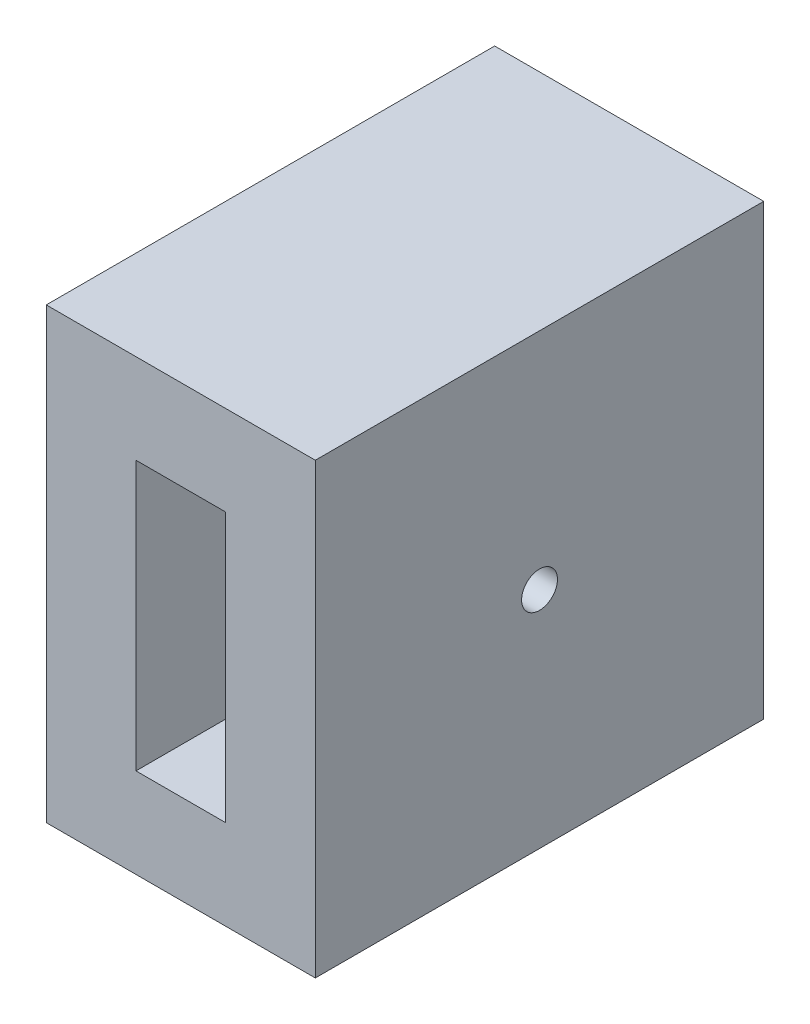
ISO-10303-21;
HEADER;
FILE_DESCRIPTION(('STEP AP214'),'2;1');
FILE_NAME('part.step','',(''),(''),'','','');
FILE_SCHEMA(('AUTOMOTIVE_DESIGN { 1 0 10303 214 1 1 1 1 }'));
ENDSEC;
DATA;
#1=APPLICATION_CONTEXT('core data for automotive mechanical design processes');
#2=APPLICATION_PROTOCOL_DEFINITION('international standard','automotive_design',2000,#1);
#3=PRODUCT_CONTEXT('',#1,'mechanical');
#4=PRODUCT('Part','Part','',(#3));
#5=PRODUCT_RELATED_PRODUCT_CATEGORY('part','',(#4));
#6=PRODUCT_DEFINITION_FORMATION('','',#4);
#7=PRODUCT_DEFINITION_CONTEXT('part definition',#1,'design');
#8=PRODUCT_DEFINITION('design','',#6,#7);
#9=PRODUCT_DEFINITION_SHAPE('','',#8);
#10=(LENGTH_UNIT() NAMED_UNIT(*) SI_UNIT(.MILLI.,.METRE.));
#11=(NAMED_UNIT(*) PLANE_ANGLE_UNIT() SI_UNIT($,.RADIAN.));
#12=(NAMED_UNIT(*) SI_UNIT($,.STERADIAN.) SOLID_ANGLE_UNIT());
#13=UNCERTAINTY_MEASURE_WITH_UNIT(LENGTH_MEASURE(1.E-05),#10,'distance_accuracy_value','');
#14=(GEOMETRIC_REPRESENTATION_CONTEXT(3) GLOBAL_UNCERTAINTY_ASSIGNED_CONTEXT((#13)) GLOBAL_UNIT_ASSIGNED_CONTEXT((#10,
#11,#12)) REPRESENTATION_CONTEXT('',''));
#15=CARTESIAN_POINT('',(0.,0.,0.));
#16=DIRECTION('',(0.,0.,1.));
#17=DIRECTION('',(1.,0.,0.));
#18=AXIS2_PLACEMENT_3D('',#15,#16,#17);
#19=CARTESIAN_POINT('',(0.,0.,50.));
#20=DIRECTION('',(0.,0.,1.));
#21=DIRECTION('',(1.,0.,0.));
#22=AXIS2_PLACEMENT_3D('',#19,#20,#21);
#23=PLANE('',#22);
#24=DIRECTION('',(0.,-1.,0.));
#25=VECTOR('',#24,1.);
#26=CARTESIAN_POINT('',(-15.,25.,50.));
#27=LINE('',#26,#25);
#28=CARTESIAN_POINT('',(-15.,25.,50.));
#29=VERTEX_POINT('',#28);
#30=CARTESIAN_POINT('',(-15.,-25.,50.));
#31=VERTEX_POINT('',#30);
#32=EDGE_CURVE('E137',#29,#31,#27,.T.);
#33=ORIENTED_EDGE('',*,*,#32,.T.);
#34=DIRECTION('',(1.,0.,0.));
#35=VECTOR('',#34,1.);
#36=CARTESIAN_POINT('',(-15.,-25.,50.));
#37=LINE('',#36,#35);
#38=CARTESIAN_POINT('',(15.,-25.,50.));
#39=VERTEX_POINT('',#38);
#40=EDGE_CURVE('E140',#31,#39,#37,.T.);
#41=ORIENTED_EDGE('',*,*,#40,.T.);
#42=DIRECTION('',(0.,1.,0.));
#43=VECTOR('',#42,1.);
#44=CARTESIAN_POINT('',(15.,25.,50.));
#45=LINE('',#44,#43);
#46=CARTESIAN_POINT('',(15.,25.,50.));
#47=VERTEX_POINT('',#46);
#48=EDGE_CURVE('E143',#39,#47,#45,.T.);
#49=ORIENTED_EDGE('',*,*,#48,.T.);
#50=DIRECTION('',(-1.,0.,0.));
#51=VECTOR('',#50,1.);
#52=CARTESIAN_POINT('',(-15.,25.,50.));
#53=LINE('',#52,#51);
#54=EDGE_CURVE('E145',#47,#29,#53,.T.);
#55=ORIENTED_EDGE('',*,*,#54,.T.);
#56=EDGE_LOOP('',(#33,#41,#49,#55));
#57=FACE_BOUND('',#56,.T.);
#58=DIRECTION('',(-1.,0.,0.));
#59=VECTOR('',#58,1.);
#60=CARTESIAN_POINT('',(-5.,15.,50.));
#61=LINE('',#60,#59);
#62=CARTESIAN_POINT('',(5.,15.,50.));
#63=VERTEX_POINT('',#62);
#64=CARTESIAN_POINT('',(-5.,15.,50.));
#65=VERTEX_POINT('',#64);
#66=EDGE_CURVE('E107',#63,#65,#61,.T.);
#67=ORIENTED_EDGE('',*,*,#66,.F.);
#68=DIRECTION('',(0.,1.,0.));
#69=VECTOR('',#68,1.);
#70=CARTESIAN_POINT('',(5.,15.,50.));
#71=LINE('',#70,#69);
#72=CARTESIAN_POINT('',(5.,-15.,50.));
#73=VERTEX_POINT('',#72);
#74=EDGE_CURVE('E99',#73,#63,#71,.T.);
#75=ORIENTED_EDGE('',*,*,#74,.F.);
#76=DIRECTION('',(1.,0.,0.));
#77=VECTOR('',#76,1.);
#78=CARTESIAN_POINT('',(-5.,-15.,50.));
#79=LINE('',#78,#77);
#80=CARTESIAN_POINT('',(-5.,-15.,50.));
#81=VERTEX_POINT('',#80);
#82=EDGE_CURVE('E121',#81,#73,#79,.T.);
#83=ORIENTED_EDGE('',*,*,#82,.F.);
#84=DIRECTION('',(0.,-1.,0.));
#85=VECTOR('',#84,1.);
#86=CARTESIAN_POINT('',(-5.,15.,50.));
#87=LINE('',#86,#85);
#88=EDGE_CURVE('E119',#65,#81,#87,.T.);
#89=ORIENTED_EDGE('',*,*,#88,.F.);
#90=EDGE_LOOP('',(#67,#75,#83,#89));
#91=FACE_BOUND('',#90,.T.);
#92=ADVANCED_FACE('F34',(#57,#91),#23,.T.);
#93=CARTESIAN_POINT('',(0.,0.,0.));
#94=DIRECTION('',(0.,0.,1.));
#95=DIRECTION('',(1.,0.,0.));
#96=AXIS2_PLACEMENT_3D('',#93,#94,#95);
#97=PLANE('',#96);
#98=DIRECTION('',(0.,-1.,0.));
#99=VECTOR('',#98,1.);
#100=CARTESIAN_POINT('',(-15.,25.,0.));
#101=LINE('',#100,#99);
#102=CARTESIAN_POINT('',(-15.,25.,0.));
#103=VERTEX_POINT('',#102);
#104=CARTESIAN_POINT('',(-15.,-25.,0.));
#105=VERTEX_POINT('',#104);
#106=EDGE_CURVE('E115',#103,#105,#101,.T.);
#107=ORIENTED_EDGE('',*,*,#106,.F.);
#108=DIRECTION('',(-1.,0.,0.));
#109=VECTOR('',#108,1.);
#110=CARTESIAN_POINT('',(-15.,25.,0.));
#111=LINE('',#110,#109);
#112=CARTESIAN_POINT('',(15.,25.,0.));
#113=VERTEX_POINT('',#112);
#114=EDGE_CURVE('E141',#113,#103,#111,.T.);
#115=ORIENTED_EDGE('',*,*,#114,.F.);
#116=DIRECTION('',(0.,1.,0.));
#117=VECTOR('',#116,1.);
#118=CARTESIAN_POINT('',(15.,25.,0.));
#119=LINE('',#118,#117);
#120=CARTESIAN_POINT('',(15.,-25.,0.));
#121=VERTEX_POINT('',#120);
#122=EDGE_CURVE('E152',#121,#113,#119,.T.);
#123=ORIENTED_EDGE('',*,*,#122,.F.);
#124=DIRECTION('',(1.,0.,0.));
#125=VECTOR('',#124,1.);
#126=CARTESIAN_POINT('',(-15.,-25.,0.));
#127=LINE('',#126,#125);
#128=EDGE_CURVE('E150',#105,#121,#127,.T.);
#129=ORIENTED_EDGE('',*,*,#128,.F.);
#130=EDGE_LOOP('',(#107,#115,#123,#129));
#131=FACE_BOUND('',#130,.T.);
#132=DIRECTION('',(0.,1.,0.));
#133=VECTOR('',#132,1.);
#134=CARTESIAN_POINT('',(5.,15.,0.));
#135=LINE('',#134,#133);
#136=CARTESIAN_POINT('',(5.,-15.,0.));
#137=VERTEX_POINT('',#136);
#138=CARTESIAN_POINT('',(5.,15.,0.));
#139=VERTEX_POINT('',#138);
#140=EDGE_CURVE('E57',#137,#139,#135,.T.);
#141=ORIENTED_EDGE('',*,*,#140,.T.);
#142=DIRECTION('',(-1.,0.,0.));
#143=VECTOR('',#142,1.);
#144=CARTESIAN_POINT('',(-5.,15.,0.));
#145=LINE('',#144,#143);
#146=CARTESIAN_POINT('',(-5.,15.,0.));
#147=VERTEX_POINT('',#146);
#148=EDGE_CURVE('E114',#139,#147,#145,.T.);
#149=ORIENTED_EDGE('',*,*,#148,.T.);
#150=DIRECTION('',(0.,-1.,0.));
#151=VECTOR('',#150,1.);
#152=CARTESIAN_POINT('',(-5.,15.,0.));
#153=LINE('',#152,#151);
#154=CARTESIAN_POINT('',(-5.,-15.,0.));
#155=VERTEX_POINT('',#154);
#156=EDGE_CURVE('E129',#147,#155,#153,.T.);
#157=ORIENTED_EDGE('',*,*,#156,.T.);
#158=DIRECTION('',(1.,0.,0.));
#159=VECTOR('',#158,1.);
#160=CARTESIAN_POINT('',(-5.,-15.,0.));
#161=LINE('',#160,#159);
#162=EDGE_CURVE('E108',#155,#137,#161,.T.);
#163=ORIENTED_EDGE('',*,*,#162,.T.);
#164=EDGE_LOOP('',(#141,#149,#157,#163));
#165=FACE_BOUND('',#164,.T.);
#166=ADVANCED_FACE('F170',(#131,#165),#97,.F.);
#167=CARTESIAN_POINT('',(-15.,25.,50.));
#168=DIRECTION('',(1.,0.,0.));
#169=DIRECTION('',(0.,1.,0.));
#170=AXIS2_PLACEMENT_3D('',#167,#168,#169);
#171=PLANE('',#170);
#172=ORIENTED_EDGE('',*,*,#106,.T.);
#173=DIRECTION('',(0.,0.,-1.));
#174=VECTOR('',#173,1.);
#175=CARTESIAN_POINT('',(-15.,-25.,50.));
#176=LINE('',#175,#174);
#177=EDGE_CURVE('E11',#31,#105,#176,.T.);
#178=ORIENTED_EDGE('',*,*,#177,.F.);
#179=ORIENTED_EDGE('',*,*,#32,.F.);
#180=DIRECTION('',(0.,0.,-1.));
#181=VECTOR('',#180,1.);
#182=CARTESIAN_POINT('',(-15.,25.,50.));
#183=LINE('',#182,#181);
#184=EDGE_CURVE('E147',#29,#103,#183,.T.);
#185=ORIENTED_EDGE('',*,*,#184,.T.);
#186=EDGE_LOOP('',(#172,#178,#179,#185));
#187=FACE_BOUND('',#186,.T.);
#188=ADVANCED_FACE('F36',(#187),#171,.F.);
#189=CARTESIAN_POINT('',(-15.,-25.,50.));
#190=DIRECTION('',(0.,1.,0.));
#191=DIRECTION('',(0.,0.,1.));
#192=AXIS2_PLACEMENT_3D('',#189,#190,#191);
#193=PLANE('',#192);
#194=ORIENTED_EDGE('',*,*,#128,.T.);
#195=DIRECTION('',(0.,0.,-1.));
#196=VECTOR('',#195,1.);
#197=CARTESIAN_POINT('',(15.,-25.,50.));
#198=LINE('',#197,#196);
#199=EDGE_CURVE('E42',#39,#121,#198,.T.);
#200=ORIENTED_EDGE('',*,*,#199,.F.);
#201=ORIENTED_EDGE('',*,*,#40,.F.);
#202=ORIENTED_EDGE('',*,*,#177,.T.);
#203=EDGE_LOOP('',(#194,#200,#201,#202));
#204=FACE_BOUND('',#203,.T.);
#205=ADVANCED_FACE('F180',(#204),#193,.F.);
#206=CARTESIAN_POINT('',(15.,25.,50.));
#207=DIRECTION('',(-1.,0.,0.));
#208=DIRECTION('',(0.,-1.,0.));
#209=AXIS2_PLACEMENT_3D('',#206,#207,#208);
#210=PLANE('',#209);
#211=CARTESIAN_POINT('',(15.,0.,25.));
#212=DIRECTION('',(1.,0.,0.));
#213=DIRECTION('',(0.,1.,0.));
#214=AXIS2_PLACEMENT_3D('',#211,#212,#213);
#215=CIRCLE('',#214,2.);
#216=CARTESIAN_POINT('',(15.,2.,25.));
#217=VERTEX_POINT('',#216);
#218=EDGE_CURVE('E209',#217,#217,#215,.T.);
#219=ORIENTED_EDGE('',*,*,#218,.F.);
#220=EDGE_LOOP('',(#219));
#221=FACE_BOUND('',#220,.T.);
#222=ORIENTED_EDGE('',*,*,#122,.T.);
#223=DIRECTION('',(0.,0.,-1.));
#224=VECTOR('',#223,1.);
#225=CARTESIAN_POINT('',(15.,25.,50.));
#226=LINE('',#225,#224);
#227=EDGE_CURVE('E157',#47,#113,#226,.T.);
#228=ORIENTED_EDGE('',*,*,#227,.F.);
#229=ORIENTED_EDGE('',*,*,#48,.F.);
#230=ORIENTED_EDGE('',*,*,#199,.T.);
#231=EDGE_LOOP('',(#222,#228,#229,#230));
#232=FACE_BOUND('',#231,.T.);
#233=ADVANCED_FACE('F164',(#221,#232),#210,.F.);
#234=CARTESIAN_POINT('',(-15.,25.,50.));
#235=DIRECTION('',(0.,-1.,0.));
#236=DIRECTION('',(0.,0.,-1.));
#237=AXIS2_PLACEMENT_3D('',#234,#235,#236);
#238=PLANE('',#237);
#239=ORIENTED_EDGE('',*,*,#114,.T.);
#240=ORIENTED_EDGE('',*,*,#184,.F.);
#241=ORIENTED_EDGE('',*,*,#54,.F.);
#242=ORIENTED_EDGE('',*,*,#227,.T.);
#243=EDGE_LOOP('',(#239,#240,#241,#242));
#244=FACE_BOUND('',#243,.T.);
#245=ADVANCED_FACE('F174',(#244),#238,.F.);
#246=CARTESIAN_POINT('',(5.,15.,50.));
#247=DIRECTION('',(-1.,0.,0.));
#248=DIRECTION('',(0.,-1.,0.));
#249=AXIS2_PLACEMENT_3D('',#246,#247,#248);
#250=PLANE('',#249);
#251=CARTESIAN_POINT('',(5.,0.,25.));
#252=DIRECTION('',(1.,0.,0.));
#253=DIRECTION('',(0.,1.,0.));
#254=AXIS2_PLACEMENT_3D('',#251,#252,#253);
#255=CIRCLE('',#254,2.);
#256=CARTESIAN_POINT('',(5.,2.,25.));
#257=VERTEX_POINT('',#256);
#258=EDGE_CURVE('E127',#257,#257,#255,.T.);
#259=ORIENTED_EDGE('',*,*,#258,.T.);
#260=EDGE_LOOP('',(#259));
#261=FACE_BOUND('',#260,.T.);
#262=ORIENTED_EDGE('',*,*,#140,.F.);
#263=DIRECTION('',(0.,0.,-1.));
#264=VECTOR('',#263,1.);
#265=CARTESIAN_POINT('',(5.,-15.,50.));
#266=LINE('',#265,#264);
#267=EDGE_CURVE('E103',#73,#137,#266,.T.);
#268=ORIENTED_EDGE('',*,*,#267,.F.);
#269=ORIENTED_EDGE('',*,*,#74,.T.);
#270=DIRECTION('',(0.,0.,-1.));
#271=VECTOR('',#270,1.);
#272=CARTESIAN_POINT('',(5.,15.,50.));
#273=LINE('',#272,#271);
#274=EDGE_CURVE('E102',#63,#139,#273,.T.);
#275=ORIENTED_EDGE('',*,*,#274,.T.);
#276=EDGE_LOOP('',(#262,#268,#269,#275));
#277=FACE_BOUND('',#276,.T.);
#278=ADVANCED_FACE('F101',(#261,#277),#250,.T.);
#279=CARTESIAN_POINT('',(-5.,15.,50.));
#280=DIRECTION('',(0.,-1.,0.));
#281=DIRECTION('',(0.,0.,-1.));
#282=AXIS2_PLACEMENT_3D('',#279,#280,#281);
#283=PLANE('',#282);
#284=ORIENTED_EDGE('',*,*,#148,.F.);
#285=ORIENTED_EDGE('',*,*,#274,.F.);
#286=ORIENTED_EDGE('',*,*,#66,.T.);
#287=DIRECTION('',(0.,0.,-1.));
#288=VECTOR('',#287,1.);
#289=CARTESIAN_POINT('',(-5.,15.,50.));
#290=LINE('',#289,#288);
#291=EDGE_CURVE('E116',#65,#147,#290,.T.);
#292=ORIENTED_EDGE('',*,*,#291,.T.);
#293=EDGE_LOOP('',(#284,#285,#286,#292));
#294=FACE_BOUND('',#293,.T.);
#295=ADVANCED_FACE('F111',(#294),#283,.T.);
#296=CARTESIAN_POINT('',(-5.,15.,50.));
#297=DIRECTION('',(1.,0.,0.));
#298=DIRECTION('',(0.,1.,0.));
#299=AXIS2_PLACEMENT_3D('',#296,#297,#298);
#300=PLANE('',#299);
#301=ORIENTED_EDGE('',*,*,#156,.F.);
#302=ORIENTED_EDGE('',*,*,#291,.F.);
#303=ORIENTED_EDGE('',*,*,#88,.T.);
#304=DIRECTION('',(0.,0.,-1.));
#305=VECTOR('',#304,1.);
#306=CARTESIAN_POINT('',(-5.,-15.,50.));
#307=LINE('',#306,#305);
#308=EDGE_CURVE('E49',#81,#155,#307,.T.);
#309=ORIENTED_EDGE('',*,*,#308,.T.);
#310=EDGE_LOOP('',(#301,#302,#303,#309));
#311=FACE_BOUND('',#310,.T.);
#312=ADVANCED_FACE('F205',(#311),#300,.T.);
#313=CARTESIAN_POINT('',(-5.,-15.,50.));
#314=DIRECTION('',(0.,1.,0.));
#315=DIRECTION('',(0.,0.,1.));
#316=AXIS2_PLACEMENT_3D('',#313,#314,#315);
#317=PLANE('',#316);
#318=ORIENTED_EDGE('',*,*,#162,.F.);
#319=ORIENTED_EDGE('',*,*,#308,.F.);
#320=ORIENTED_EDGE('',*,*,#82,.T.);
#321=ORIENTED_EDGE('',*,*,#267,.T.);
#322=EDGE_LOOP('',(#318,#319,#320,#321));
#323=FACE_BOUND('',#322,.T.);
#324=ADVANCED_FACE('F216',(#323),#317,.T.);
#325=CARTESIAN_POINT('',(5.,0.,25.));
#326=DIRECTION('',(1.,0.,0.));
#327=DIRECTION('',(0.,1.,0.));
#328=AXIS2_PLACEMENT_3D('',#325,#326,#327);
#329=CYLINDRICAL_SURFACE('',#328,2.);
#330=ORIENTED_EDGE('',*,*,#258,.F.);
#331=EDGE_LOOP('',(#330));
#332=FACE_BOUND('',#331,.T.);
#333=ORIENTED_EDGE('',*,*,#218,.T.);
#334=EDGE_LOOP('',(#333));
#335=FACE_BOUND('',#334,.T.);
#336=ADVANCED_FACE('F214',(#332,#335),#329,.F.);
#337=CLOSED_SHELL('',(#92,#166,#188,#205,#233,#245,#278,#295,#312,#324,#336));
#338=MANIFOLD_SOLID_BREP('B2',#337);
#339=ADVANCED_BREP_SHAPE_REPRESENTATION('',(#18,#338),#14);
#340=SHAPE_DEFINITION_REPRESENTATION(#9,#339);
ENDSEC;
END-ISO-10303-21;
